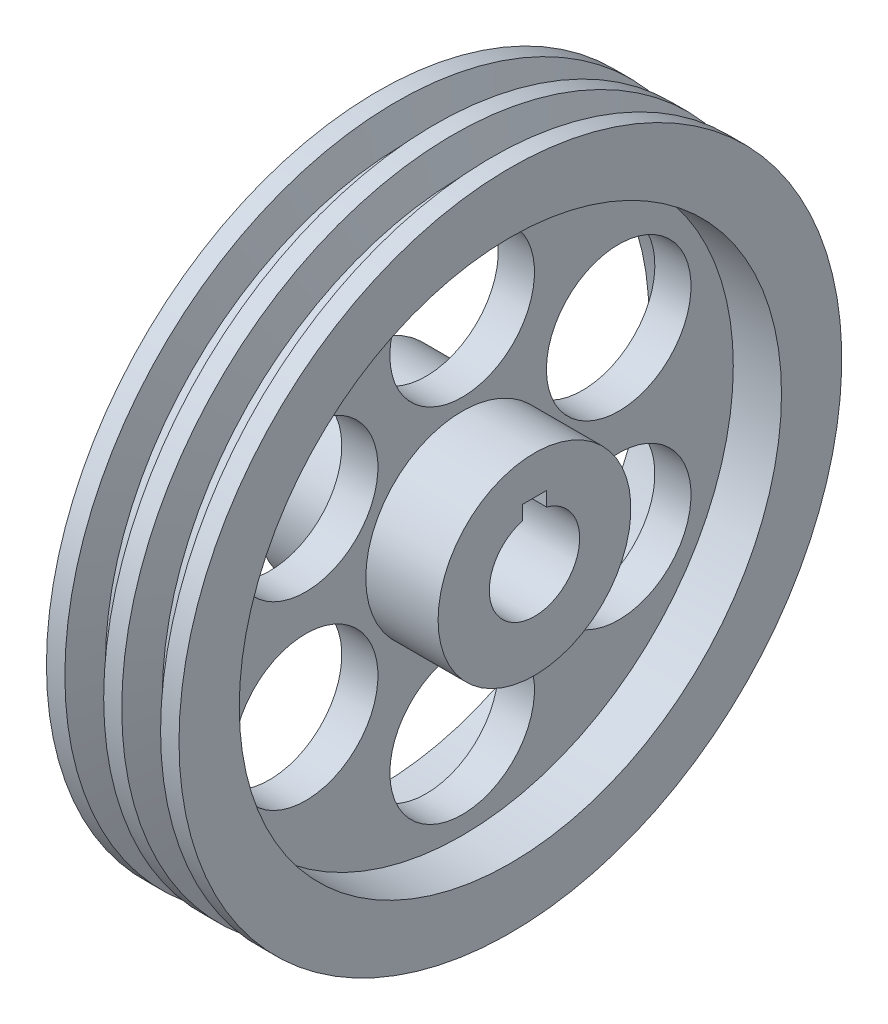
ISO-10303-21;
HEADER;
FILE_DESCRIPTION(('STEP AP214'),'2;1');
FILE_NAME('part.step','',(''),(''),'','','');
FILE_SCHEMA(('AUTOMOTIVE_DESIGN { 1 0 10303 214 1 1 1 1 }'));
ENDSEC;
DATA;
#1=APPLICATION_CONTEXT('core data for automotive mechanical design processes');
#2=APPLICATION_PROTOCOL_DEFINITION('international standard','automotive_design',2000,#1);
#3=PRODUCT_CONTEXT('',#1,'mechanical');
#4=PRODUCT('Part','Part','',(#3));
#5=PRODUCT_RELATED_PRODUCT_CATEGORY('part','',(#4));
#6=PRODUCT_DEFINITION_FORMATION('','',#4);
#7=PRODUCT_DEFINITION_CONTEXT('part definition',#1,'design');
#8=PRODUCT_DEFINITION('design','',#6,#7);
#9=PRODUCT_DEFINITION_SHAPE('','',#8);
#10=(LENGTH_UNIT() NAMED_UNIT(*) SI_UNIT(.MILLI.,.METRE.));
#11=(NAMED_UNIT(*) PLANE_ANGLE_UNIT() SI_UNIT($,.RADIAN.));
#12=(NAMED_UNIT(*) SI_UNIT($,.STERADIAN.) SOLID_ANGLE_UNIT());
#13=UNCERTAINTY_MEASURE_WITH_UNIT(LENGTH_MEASURE(1.E-05),#10,'distance_accuracy_value','');
#14=(GEOMETRIC_REPRESENTATION_CONTEXT(3) GLOBAL_UNCERTAINTY_ASSIGNED_CONTEXT((#13)) GLOBAL_UNIT_ASSIGNED_CONTEXT((#10,
#11,#12)) REPRESENTATION_CONTEXT('',''));
#15=CARTESIAN_POINT('',(0.,0.,0.));
#16=DIRECTION('',(0.,0.,1.));
#17=DIRECTION('',(1.,0.,0.));
#18=AXIS2_PLACEMENT_3D('',#15,#16,#17);
#19=CARTESIAN_POINT('',(14.051864277841,7.5,0.));
#20=DIRECTION('',(-1.,0.,0.));
#21=DIRECTION('',(0.,0.,1.));
#22=AXIS2_PLACEMENT_3D('',#19,#20,#21);
#23=PLANE('',#22);
#24=CARTESIAN_POINT('',(14.051864277841,0.,0.));
#25=DIRECTION('',(-1.,0.,0.));
#26=DIRECTION('',(0.,0.,1.));
#27=AXIS2_PLACEMENT_3D('',#24,#25,#26);
#28=CIRCLE('',#27,16.);
#29=CARTESIAN_POINT('',(14.051864277841,0.,16.));
#30=VERTEX_POINT('',#29);
#31=EDGE_CURVE('E193',#30,#30,#28,.T.);
#32=ORIENTED_EDGE('',*,*,#31,.F.);
#33=EDGE_LOOP('',(#32));
#34=FACE_BOUND('',#33,.T.);
#35=DIRECTION('',(0.,0.,1.));
#36=VECTOR('',#35,1.);
#37=CARTESIAN_POINT('',(14.051864277841,9.6,2.));
#38=LINE('',#37,#36);
#39=CARTESIAN_POINT('',(14.051864277841,9.6,-2.));
#40=VERTEX_POINT('',#39);
#41=CARTESIAN_POINT('',(14.051864277841,9.6,2.));
#42=VERTEX_POINT('',#41);
#43=EDGE_CURVE('E105',#40,#42,#38,.T.);
#44=ORIENTED_EDGE('',*,*,#43,.F.);
#45=DIRECTION('',(0.,1.,0.));
#46=VECTOR('',#45,1.);
#47=CARTESIAN_POINT('',(14.051864277841,9.6,-2.));
#48=LINE('',#47,#46);
#49=CARTESIAN_POINT('',(14.051864277841,7.22841614740048,-2.));
#50=VERTEX_POINT('',#49);
#51=EDGE_CURVE('E83',#50,#40,#48,.T.);
#52=ORIENTED_EDGE('',*,*,#51,.F.);
#53=CARTESIAN_POINT('',(14.051864277841,0.,0.));
#54=DIRECTION('',(-1.,0.,0.));
#55=DIRECTION('',(0.,0.,1.));
#56=AXIS2_PLACEMENT_3D('',#53,#54,#55);
#57=CIRCLE('',#56,7.5);
#58=CARTESIAN_POINT('',(14.051864277841,7.22841614740048,2.));
#59=VERTEX_POINT('',#58);
#60=EDGE_CURVE('E118',#50,#59,#57,.T.);
#61=ORIENTED_EDGE('',*,*,#60,.T.);
#62=DIRECTION('',(0.,-1.,0.));
#63=VECTOR('',#62,1.);
#64=CARTESIAN_POINT('',(14.051864277841,9.6,2.));
#65=LINE('',#64,#63);
#66=EDGE_CURVE('E54',#42,#59,#65,.T.);
#67=ORIENTED_EDGE('',*,*,#66,.F.);
#68=EDGE_LOOP('',(#44,#52,#61,#67));
#69=FACE_BOUND('',#68,.T.);
#70=ADVANCED_FACE('F39',(#34,#69),#23,.F.);
#71=CARTESIAN_POINT('',(-49.9227938913029,0.,0.));
#72=DIRECTION('',(-1.,0.,0.));
#73=DIRECTION('',(0.,0.,1.));
#74=AXIS2_PLACEMENT_3D('',#71,#72,#73);
#75=CYLINDRICAL_SURFACE('',#74,16.);
#76=CARTESIAN_POINT('',(2.05186427784097,0.,0.));
#77=DIRECTION('',(-1.,0.,0.));
#78=DIRECTION('',(0.,0.,1.));
#79=AXIS2_PLACEMENT_3D('',#76,#77,#78);
#80=CIRCLE('',#79,16.);
#81=CARTESIAN_POINT('',(2.05186427784097,0.,16.));
#82=VERTEX_POINT('',#81);
#83=EDGE_CURVE('E189',#82,#82,#80,.T.);
#84=ORIENTED_EDGE('',*,*,#83,.F.);
#85=EDGE_LOOP('',(#84));
#86=FACE_BOUND('',#85,.T.);
#87=ORIENTED_EDGE('',*,*,#31,.T.);
#88=EDGE_LOOP('',(#87));
#89=FACE_BOUND('',#88,.T.);
#90=ADVANCED_FACE('F202',(#86,#89),#75,.T.);
#91=CARTESIAN_POINT('',(2.05186427784096,16.,0.));
#92=DIRECTION('',(-1.,0.,0.));
#93=DIRECTION('',(0.,0.,1.));
#94=AXIS2_PLACEMENT_3D('',#91,#92,#93);
#95=PLANE('',#94);
#96=CARTESIAN_POINT('',(2.05186427784096,15.0000000000003,25.980762113533));
#97=DIRECTION('',(-1.,0.,0.));
#98=DIRECTION('',(0.,0.,1.));
#99=AXIS2_PLACEMENT_3D('',#96,#97,#98);
#100=CIRCLE('',#99,12.);
#101=CARTESIAN_POINT('',(2.05186427784096,15.0000000000003,37.980762113533));
#102=VERTEX_POINT('',#101);
#103=EDGE_CURVE('E339',#102,#102,#100,.T.);
#104=ORIENTED_EDGE('',*,*,#103,.T.);
#105=EDGE_LOOP('',(#104));
#106=FACE_BOUND('',#105,.T.);
#107=CARTESIAN_POINT('',(2.05186427784096,-14.9999999999998,25.9807621135333));
#108=DIRECTION('',(-1.,0.,0.));
#109=DIRECTION('',(0.,0.,1.));
#110=AXIS2_PLACEMENT_3D('',#107,#108,#109);
#111=CIRCLE('',#110,12.);
#112=CARTESIAN_POINT('',(2.05186427784096,-14.9999999999998,37.9807621135333));
#113=VERTEX_POINT('',#112);
#114=EDGE_CURVE('E329',#113,#113,#111,.T.);
#115=ORIENTED_EDGE('',*,*,#114,.T.);
#116=EDGE_LOOP('',(#115));
#117=FACE_BOUND('',#116,.T.);
#118=CARTESIAN_POINT('',(2.05186427784096,-30.,0.));
#119=DIRECTION('',(-1.,0.,0.));
#120=DIRECTION('',(0.,0.,1.));
#121=AXIS2_PLACEMENT_3D('',#118,#119,#120);
#122=CIRCLE('',#121,12.);
#123=CARTESIAN_POINT('',(2.05186427784096,-30.,12.));
#124=VERTEX_POINT('',#123);
#125=EDGE_CURVE('E323',#124,#124,#122,.T.);
#126=ORIENTED_EDGE('',*,*,#125,.T.);
#127=EDGE_LOOP('',(#126));
#128=FACE_BOUND('',#127,.T.);
#129=CARTESIAN_POINT('',(2.05186427784096,-15.0000000000001,-25.9807621135331));
#130=DIRECTION('',(-1.,0.,0.));
#131=DIRECTION('',(0.,0.,1.));
#132=AXIS2_PLACEMENT_3D('',#129,#130,#131);
#133=CIRCLE('',#132,12.);
#134=CARTESIAN_POINT('',(2.05186427784096,-15.0000000000001,-13.9807621135331));
#135=VERTEX_POINT('',#134);
#136=EDGE_CURVE('E320',#135,#135,#133,.T.);
#137=ORIENTED_EDGE('',*,*,#136,.T.);
#138=EDGE_LOOP('',(#137));
#139=FACE_BOUND('',#138,.T.);
#140=CARTESIAN_POINT('',(2.05186427784096,14.9999999999999,-25.9807621135332));
#141=DIRECTION('',(-1.,0.,0.));
#142=DIRECTION('',(0.,0.,1.));
#143=AXIS2_PLACEMENT_3D('',#140,#141,#142);
#144=CIRCLE('',#143,12.);
#145=CARTESIAN_POINT('',(2.05186427784096,14.9999999999999,-13.9807621135332));
#146=VERTEX_POINT('',#145);
#147=EDGE_CURVE('E324',#146,#146,#144,.T.);
#148=ORIENTED_EDGE('',*,*,#147,.T.);
#149=EDGE_LOOP('',(#148));
#150=FACE_BOUND('',#149,.T.);
#151=CARTESIAN_POINT('',(2.05186427784096,30.,0.));
#152=DIRECTION('',(-1.,0.,0.));
#153=DIRECTION('',(0.,0.,1.));
#154=AXIS2_PLACEMENT_3D('',#151,#152,#153);
#155=CIRCLE('',#154,12.);
#156=CARTESIAN_POINT('',(2.05186427784096,30.,12.));
#157=VERTEX_POINT('',#156);
#158=EDGE_CURVE('E108',#157,#157,#155,.T.);
#159=ORIENTED_EDGE('',*,*,#158,.T.);
#160=EDGE_LOOP('',(#159));
#161=FACE_BOUND('',#160,.T.);
#162=CARTESIAN_POINT('',(2.05186427784096,0.,0.));
#163=DIRECTION('',(-1.,0.,0.));
#164=DIRECTION('',(0.,0.,1.));
#165=AXIS2_PLACEMENT_3D('',#162,#163,#164);
#166=CIRCLE('',#165,45.);
#167=CARTESIAN_POINT('',(2.05186427784096,0.,45.));
#168=VERTEX_POINT('',#167);
#169=EDGE_CURVE('E185',#168,#168,#166,.T.);
#170=ORIENTED_EDGE('',*,*,#169,.F.);
#171=EDGE_LOOP('',(#170));
#172=FACE_BOUND('',#171,.T.);
#173=ORIENTED_EDGE('',*,*,#83,.T.);
#174=EDGE_LOOP('',(#173));
#175=FACE_BOUND('',#174,.T.);
#176=ADVANCED_FACE('F207',(#106,#117,#128,#139,#150,#161,#172,#175),#95,.F.);
#177=CARTESIAN_POINT('',(-49.9227938913029,0.,0.));
#178=DIRECTION('',(-1.,0.,0.));
#179=DIRECTION('',(0.,0.,1.));
#180=AXIS2_PLACEMENT_3D('',#177,#178,#179);
#181=CYLINDRICAL_SURFACE('',#180,45.);
#182=CARTESIAN_POINT('',(10.051864277841,0.,0.));
#183=DIRECTION('',(-1.,0.,0.));
#184=DIRECTION('',(0.,0.,1.));
#185=AXIS2_PLACEMENT_3D('',#182,#183,#184);
#186=CIRCLE('',#185,45.);
#187=CARTESIAN_POINT('',(10.051864277841,0.,45.));
#188=VERTEX_POINT('',#187);
#189=EDGE_CURVE('E181',#188,#188,#186,.T.);
#190=ORIENTED_EDGE('',*,*,#189,.F.);
#191=EDGE_LOOP('',(#190));
#192=FACE_BOUND('',#191,.T.);
#193=ORIENTED_EDGE('',*,*,#169,.T.);
#194=EDGE_LOOP('',(#193));
#195=FACE_BOUND('',#194,.T.);
#196=ADVANCED_FACE('F214',(#192,#195),#181,.F.);
#197=CARTESIAN_POINT('',(10.051864277841,45.,0.));
#198=DIRECTION('',(-1.,0.,0.));
#199=DIRECTION('',(0.,0.,1.));
#200=AXIS2_PLACEMENT_3D('',#197,#198,#199);
#201=PLANE('',#200);
#202=CARTESIAN_POINT('',(10.051864277841,0.,0.));
#203=DIRECTION('',(-1.,0.,0.));
#204=DIRECTION('',(0.,0.,1.));
#205=AXIS2_PLACEMENT_3D('',#202,#203,#204);
#206=CIRCLE('',#205,55.);
#207=CARTESIAN_POINT('',(10.051864277841,0.,55.));
#208=VERTEX_POINT('',#207);
#209=EDGE_CURVE('E177',#208,#208,#206,.T.);
#210=ORIENTED_EDGE('',*,*,#209,.F.);
#211=EDGE_LOOP('',(#210));
#212=FACE_BOUND('',#211,.T.);
#213=ORIENTED_EDGE('',*,*,#189,.T.);
#214=EDGE_LOOP('',(#213));
#215=FACE_BOUND('',#214,.T.);
#216=ADVANCED_FACE('F221',(#212,#215),#201,.F.);
#217=CARTESIAN_POINT('',(-49.9227938913029,0.,0.));
#218=DIRECTION('',(-1.,0.,0.));
#219=DIRECTION('',(0.,0.,1.));
#220=AXIS2_PLACEMENT_3D('',#217,#218,#219);
#221=CYLINDRICAL_SURFACE('',#220,55.);
#222=CARTESIAN_POINT('',(6.99514041073759,0.,0.));
#223=DIRECTION('',(-1.,0.,0.));
#224=DIRECTION('',(0.,0.,1.));
#225=AXIS2_PLACEMENT_3D('',#222,#223,#224);
#226=CIRCLE('',#225,55.);
#227=CARTESIAN_POINT('',(6.99514041073759,0.,55.));
#228=VERTEX_POINT('',#227);
#229=EDGE_CURVE('E173',#228,#228,#226,.T.);
#230=ORIENTED_EDGE('',*,*,#229,.F.);
#231=EDGE_LOOP('',(#230));
#232=FACE_BOUND('',#231,.T.);
#233=ORIENTED_EDGE('',*,*,#209,.T.);
#234=EDGE_LOOP('',(#233));
#235=FACE_BOUND('',#234,.T.);
#236=ADVANCED_FACE('F225',(#232,#235),#221,.T.);
#237=CARTESIAN_POINT('',(6.99514041073759,0.,0.));
#238=DIRECTION('',(1.,0.,0.));
#239=DIRECTION('',(0.,0.,-1.));
#240=AXIS2_PLACEMENT_3D('',#237,#238,#239);
#241=CONICAL_SURFACE('',#240,55.,1.23918376891598);
#242=CARTESIAN_POINT('',(5.27350234428928,0.,0.));
#243=DIRECTION('',(-1.,0.,0.));
#244=DIRECTION('',(0.,0.,1.));
#245=AXIS2_PLACEMENT_3D('',#242,#243,#244);
#246=CIRCLE('',#245,50.);
#247=CARTESIAN_POINT('',(5.27350234428928,0.,50.));
#248=VERTEX_POINT('',#247);
#249=EDGE_CURVE('E169',#248,#248,#246,.T.);
#250=ORIENTED_EDGE('',*,*,#249,.F.);
#251=EDGE_LOOP('',(#250));
#252=FACE_BOUND('',#251,.T.);
#253=ORIENTED_EDGE('',*,*,#229,.T.);
#254=EDGE_LOOP('',(#253));
#255=FACE_BOUND('',#254,.T.);
#256=ADVANCED_FACE('F229',(#252,#255),#241,.T.);
#257=CARTESIAN_POINT('',(-49.9227938913029,0.,0.));
#258=DIRECTION('',(-1.,0.,0.));
#259=DIRECTION('',(0.,0.,1.));
#260=AXIS2_PLACEMENT_3D('',#257,#258,#259);
#261=CYLINDRICAL_SURFACE('',#260,50.);
#262=CARTESIAN_POINT('',(2.27350234428927,0.,0.));
#263=DIRECTION('',(-1.,0.,0.));
#264=DIRECTION('',(0.,0.,1.));
#265=AXIS2_PLACEMENT_3D('',#262,#263,#264);
#266=CIRCLE('',#265,50.);
#267=CARTESIAN_POINT('',(2.27350234428927,0.,50.));
#268=VERTEX_POINT('',#267);
#269=EDGE_CURVE('E165',#268,#268,#266,.T.);
#270=ORIENTED_EDGE('',*,*,#269,.F.);
#271=EDGE_LOOP('',(#270));
#272=FACE_BOUND('',#271,.T.);
#273=ORIENTED_EDGE('',*,*,#249,.T.);
#274=EDGE_LOOP('',(#273));
#275=FACE_BOUND('',#274,.T.);
#276=ADVANCED_FACE('F233',(#272,#275),#261,.T.);
#277=CARTESIAN_POINT('',(2.27350234428927,0.,0.));
#278=DIRECTION('',(-1.,0.,0.));
#279=DIRECTION('',(0.,0.,1.));
#280=AXIS2_PLACEMENT_3D('',#277,#278,#279);
#281=CONICAL_SURFACE('',#280,50.,1.23918376891598);
#282=CARTESIAN_POINT('',(0.551864277840965,0.,0.));
#283=DIRECTION('',(-1.,0.,0.));
#284=DIRECTION('',(0.,0.,1.));
#285=AXIS2_PLACEMENT_3D('',#282,#283,#284);
#286=CIRCLE('',#285,55.);
#287=CARTESIAN_POINT('',(0.551864277840965,0.,55.));
#288=VERTEX_POINT('',#287);
#289=EDGE_CURVE('E161',#288,#288,#286,.T.);
#290=ORIENTED_EDGE('',*,*,#289,.F.);
#291=EDGE_LOOP('',(#290));
#292=FACE_BOUND('',#291,.T.);
#293=ORIENTED_EDGE('',*,*,#269,.T.);
#294=EDGE_LOOP('',(#293));
#295=FACE_BOUND('',#294,.T.);
#296=ADVANCED_FACE('F237',(#292,#295),#281,.T.);
#297=CARTESIAN_POINT('',(-49.9227938913029,0.,0.));
#298=DIRECTION('',(-1.,0.,0.));
#299=DIRECTION('',(0.,0.,1.));
#300=AXIS2_PLACEMENT_3D('',#297,#298,#299);
#301=CYLINDRICAL_SURFACE('',#300,55.);
#302=CARTESIAN_POINT('',(-2.44813572215903,0.,0.));
#303=DIRECTION('',(-1.,0.,0.));
#304=DIRECTION('',(0.,0.,1.));
#305=AXIS2_PLACEMENT_3D('',#302,#303,#304);
#306=CIRCLE('',#305,55.);
#307=CARTESIAN_POINT('',(-2.44813572215903,0.,55.));
#308=VERTEX_POINT('',#307);
#309=EDGE_CURVE('E157',#308,#308,#306,.T.);
#310=ORIENTED_EDGE('',*,*,#309,.F.);
#311=EDGE_LOOP('',(#310));
#312=FACE_BOUND('',#311,.T.);
#313=ORIENTED_EDGE('',*,*,#289,.T.);
#314=EDGE_LOOP('',(#313));
#315=FACE_BOUND('',#314,.T.);
#316=ADVANCED_FACE('F241',(#312,#315),#301,.T.);
#317=CARTESIAN_POINT('',(-2.44813572215903,0.,0.));
#318=DIRECTION('',(1.,0.,0.));
#319=DIRECTION('',(0.,0.,-1.));
#320=AXIS2_PLACEMENT_3D('',#317,#318,#319);
#321=CONICAL_SURFACE('',#320,55.,1.23918376891598);
#322=CARTESIAN_POINT('',(-4.16977378860734,0.,0.));
#323=DIRECTION('',(-1.,0.,0.));
#324=DIRECTION('',(0.,0.,1.));
#325=AXIS2_PLACEMENT_3D('',#322,#323,#324);
#326=CIRCLE('',#325,50.);
#327=CARTESIAN_POINT('',(-4.16977378860734,0.,50.));
#328=VERTEX_POINT('',#327);
#329=EDGE_CURVE('E153',#328,#328,#326,.T.);
#330=ORIENTED_EDGE('',*,*,#329,.F.);
#331=EDGE_LOOP('',(#330));
#332=FACE_BOUND('',#331,.T.);
#333=ORIENTED_EDGE('',*,*,#309,.T.);
#334=EDGE_LOOP('',(#333));
#335=FACE_BOUND('',#334,.T.);
#336=ADVANCED_FACE('F245',(#332,#335),#321,.T.);
#337=CARTESIAN_POINT('',(-49.9227938913029,0.,0.));
#338=DIRECTION('',(-1.,0.,0.));
#339=DIRECTION('',(0.,0.,1.));
#340=AXIS2_PLACEMENT_3D('',#337,#338,#339);
#341=CYLINDRICAL_SURFACE('',#340,50.);
#342=CARTESIAN_POINT('',(-7.16977378860734,0.,0.));
#343=DIRECTION('',(-1.,0.,0.));
#344=DIRECTION('',(0.,0.,1.));
#345=AXIS2_PLACEMENT_3D('',#342,#343,#344);
#346=CIRCLE('',#345,50.);
#347=CARTESIAN_POINT('',(-7.16977378860734,0.,50.));
#348=VERTEX_POINT('',#347);
#349=EDGE_CURVE('E149',#348,#348,#346,.T.);
#350=ORIENTED_EDGE('',*,*,#349,.F.);
#351=EDGE_LOOP('',(#350));
#352=FACE_BOUND('',#351,.T.);
#353=ORIENTED_EDGE('',*,*,#329,.T.);
#354=EDGE_LOOP('',(#353));
#355=FACE_BOUND('',#354,.T.);
#356=ADVANCED_FACE('F249',(#352,#355),#341,.T.);
#357=CARTESIAN_POINT('',(-7.16977378860734,0.,0.));
#358=DIRECTION('',(-1.,0.,0.));
#359=DIRECTION('',(0.,0.,1.));
#360=AXIS2_PLACEMENT_3D('',#357,#358,#359);
#361=CONICAL_SURFACE('',#360,50.,1.23918376891598);
#362=CARTESIAN_POINT('',(-8.89141185505565,0.,0.));
#363=DIRECTION('',(-1.,0.,0.));
#364=DIRECTION('',(0.,0.,1.));
#365=AXIS2_PLACEMENT_3D('',#362,#363,#364);
#366=CIRCLE('',#365,55.);
#367=CARTESIAN_POINT('',(-8.89141185505565,0.,55.));
#368=VERTEX_POINT('',#367);
#369=EDGE_CURVE('E145',#368,#368,#366,.T.);
#370=ORIENTED_EDGE('',*,*,#369,.F.);
#371=EDGE_LOOP('',(#370));
#372=FACE_BOUND('',#371,.T.);
#373=ORIENTED_EDGE('',*,*,#349,.T.);
#374=EDGE_LOOP('',(#373));
#375=FACE_BOUND('',#374,.T.);
#376=ADVANCED_FACE('F253',(#372,#375),#361,.T.);
#377=CARTESIAN_POINT('',(-49.9227938913029,0.,0.));
#378=DIRECTION('',(-1.,0.,0.));
#379=DIRECTION('',(0.,0.,1.));
#380=AXIS2_PLACEMENT_3D('',#377,#378,#379);
#381=CYLINDRICAL_SURFACE('',#380,55.);
#382=CARTESIAN_POINT('',(-11.948135722159,0.,0.));
#383=DIRECTION('',(-1.,0.,0.));
#384=DIRECTION('',(0.,0.,1.));
#385=AXIS2_PLACEMENT_3D('',#382,#383,#384);
#386=CIRCLE('',#385,55.);
#387=CARTESIAN_POINT('',(-11.948135722159,0.,55.));
#388=VERTEX_POINT('',#387);
#389=EDGE_CURVE('E141',#388,#388,#386,.T.);
#390=ORIENTED_EDGE('',*,*,#389,.F.);
#391=EDGE_LOOP('',(#390));
#392=FACE_BOUND('',#391,.T.);
#393=ORIENTED_EDGE('',*,*,#369,.T.);
#394=EDGE_LOOP('',(#393));
#395=FACE_BOUND('',#394,.T.);
#396=ADVANCED_FACE('F257',(#392,#395),#381,.T.);
#397=CARTESIAN_POINT('',(-11.948135722159,45.,0.));
#398=DIRECTION('',(1.,0.,0.));
#399=DIRECTION('',(0.,0.,-1.));
#400=AXIS2_PLACEMENT_3D('',#397,#398,#399);
#401=PLANE('',#400);
#402=CARTESIAN_POINT('',(-11.948135722159,0.,0.));
#403=DIRECTION('',(-1.,0.,0.));
#404=DIRECTION('',(0.,0.,1.));
#405=AXIS2_PLACEMENT_3D('',#402,#403,#404);
#406=CIRCLE('',#405,45.);
#407=CARTESIAN_POINT('',(-11.948135722159,0.,45.));
#408=VERTEX_POINT('',#407);
#409=EDGE_CURVE('E137',#408,#408,#406,.T.);
#410=ORIENTED_EDGE('',*,*,#409,.F.);
#411=EDGE_LOOP('',(#410));
#412=FACE_BOUND('',#411,.T.);
#413=ORIENTED_EDGE('',*,*,#389,.T.);
#414=EDGE_LOOP('',(#413));
#415=FACE_BOUND('',#414,.T.);
#416=ADVANCED_FACE('F261',(#412,#415),#401,.F.);
#417=CARTESIAN_POINT('',(-49.9227938913029,0.,0.));
#418=DIRECTION('',(-1.,0.,0.));
#419=DIRECTION('',(0.,0.,1.));
#420=AXIS2_PLACEMENT_3D('',#417,#418,#419);
#421=CYLINDRICAL_SURFACE('',#420,45.);
#422=CARTESIAN_POINT('',(-3.94813572215903,0.,0.));
#423=DIRECTION('',(-1.,0.,0.));
#424=DIRECTION('',(0.,0.,1.));
#425=AXIS2_PLACEMENT_3D('',#422,#423,#424);
#426=CIRCLE('',#425,45.);
#427=CARTESIAN_POINT('',(-3.94813572215903,0.,45.));
#428=VERTEX_POINT('',#427);
#429=EDGE_CURVE('E133',#428,#428,#426,.T.);
#430=ORIENTED_EDGE('',*,*,#429,.F.);
#431=EDGE_LOOP('',(#430));
#432=FACE_BOUND('',#431,.T.);
#433=ORIENTED_EDGE('',*,*,#409,.T.);
#434=EDGE_LOOP('',(#433));
#435=FACE_BOUND('',#434,.T.);
#436=ADVANCED_FACE('F265',(#432,#435),#421,.F.);
#437=CARTESIAN_POINT('',(-3.94813572215903,16.,0.));
#438=DIRECTION('',(1.,0.,0.));
#439=DIRECTION('',(0.,0.,-1.));
#440=AXIS2_PLACEMENT_3D('',#437,#438,#439);
#441=PLANE('',#440);
#442=CARTESIAN_POINT('',(-3.94813572215903,15.0000000000003,25.980762113533));
#443=DIRECTION('',(-1.,0.,0.));
#444=DIRECTION('',(0.,-0.866025403784433,0.50000000000001));
#445=AXIS2_PLACEMENT_3D('',#442,#443,#444);
#446=CIRCLE('',#445,12.);
#447=CARTESIAN_POINT('',(-3.94813572215903,4.60769515458711,31.9807621135331));
#448=VERTEX_POINT('',#447);
#449=EDGE_CURVE('E399',#448,#448,#446,.T.);
#450=ORIENTED_EDGE('',*,*,#449,.F.);
#451=EDGE_LOOP('',(#450));
#452=FACE_BOUND('',#451,.T.);
#453=CARTESIAN_POINT('',(-3.94813572215903,-14.9999999999998,25.9807621135333));
#454=DIRECTION('',(-1.,0.,0.));
#455=DIRECTION('',(0.,-0.866025403784443,-0.499999999999992));
#456=AXIS2_PLACEMENT_3D('',#453,#454,#455);
#457=CIRCLE('',#456,12.);
#458=CARTESIAN_POINT('',(-3.94813572215903,-25.3923048454131,19.9807621135334));
#459=VERTEX_POINT('',#458);
#460=EDGE_CURVE('E403',#459,#459,#457,.T.);
#461=ORIENTED_EDGE('',*,*,#460,.F.);
#462=EDGE_LOOP('',(#461));
#463=FACE_BOUND('',#462,.T.);
#464=CARTESIAN_POINT('',(-3.94813572215903,-30.,0.));
#465=DIRECTION('',(-1.,0.,0.));
#466=DIRECTION('',(0.,0.,-1.));
#467=AXIS2_PLACEMENT_3D('',#464,#465,#466);
#468=CIRCLE('',#467,12.);
#469=CARTESIAN_POINT('',(-3.94813572215903,-30.,-12.));
#470=VERTEX_POINT('',#469);
#471=EDGE_CURVE('E407',#470,#470,#468,.T.);
#472=ORIENTED_EDGE('',*,*,#471,.F.);
#473=EDGE_LOOP('',(#472));
#474=FACE_BOUND('',#473,.T.);
#475=CARTESIAN_POINT('',(-3.94813572215903,-15.0000000000001,-25.9807621135331));
#476=DIRECTION('',(-1.,0.,0.));
#477=DIRECTION('',(0.,0.866025403784436,-0.500000000000004));
#478=AXIS2_PLACEMENT_3D('',#475,#476,#477);
#479=CIRCLE('',#478,12.);
#480=CARTESIAN_POINT('',(-3.94813572215903,-4.60769515458688,-31.9807621135331));
#481=VERTEX_POINT('',#480);
#482=EDGE_CURVE('E317',#481,#481,#479,.T.);
#483=ORIENTED_EDGE('',*,*,#482,.F.);
#484=EDGE_LOOP('',(#483));
#485=FACE_BOUND('',#484,.T.);
#486=CARTESIAN_POINT('',(-3.94813572215903,14.9999999999999,-25.9807621135332));
#487=DIRECTION('',(-1.,0.,0.));
#488=DIRECTION('',(0.,0.86602540378444,0.499999999999998));
#489=AXIS2_PLACEMENT_3D('',#486,#487,#488);
#490=CIRCLE('',#489,12.);
#491=CARTESIAN_POINT('',(-3.94813572215903,25.3923048454132,-19.9807621135332));
#492=VERTEX_POINT('',#491);
#493=EDGE_CURVE('E332',#492,#492,#490,.T.);
#494=ORIENTED_EDGE('',*,*,#493,.F.);
#495=EDGE_LOOP('',(#494));
#496=FACE_BOUND('',#495,.T.);
#497=CARTESIAN_POINT('',(-3.94813572215903,30.,0.));
#498=DIRECTION('',(-1.,0.,0.));
#499=DIRECTION('',(0.,0.,1.));
#500=AXIS2_PLACEMENT_3D('',#497,#498,#499);
#501=CIRCLE('',#500,12.);
#502=CARTESIAN_POINT('',(-3.94813572215903,30.,12.));
#503=VERTEX_POINT('',#502);
#504=EDGE_CURVE('E342',#503,#503,#501,.T.);
#505=ORIENTED_EDGE('',*,*,#504,.F.);
#506=EDGE_LOOP('',(#505));
#507=FACE_BOUND('',#506,.T.);
#508=CARTESIAN_POINT('',(-3.94813572215903,0.,0.));
#509=DIRECTION('',(-1.,0.,0.));
#510=DIRECTION('',(0.,0.,1.));
#511=AXIS2_PLACEMENT_3D('',#508,#509,#510);
#512=CIRCLE('',#511,16.);
#513=CARTESIAN_POINT('',(-3.94813572215903,0.,16.));
#514=VERTEX_POINT('',#513);
#515=EDGE_CURVE('E129',#514,#514,#512,.T.);
#516=ORIENTED_EDGE('',*,*,#515,.F.);
#517=EDGE_LOOP('',(#516));
#518=FACE_BOUND('',#517,.T.);
#519=ORIENTED_EDGE('',*,*,#429,.T.);
#520=EDGE_LOOP('',(#519));
#521=FACE_BOUND('',#520,.T.);
#522=ADVANCED_FACE('F269',(#452,#463,#474,#485,#496,#507,#518,#521),#441,.F.);
#523=CARTESIAN_POINT('',(-49.9227938913029,0.,0.));
#524=DIRECTION('',(-1.,0.,0.));
#525=DIRECTION('',(0.,0.,1.));
#526=AXIS2_PLACEMENT_3D('',#523,#524,#525);
#527=CYLINDRICAL_SURFACE('',#526,16.);
#528=CARTESIAN_POINT('',(-15.948135722159,0.,0.));
#529=DIRECTION('',(-1.,0.,0.));
#530=DIRECTION('',(0.,0.,1.));
#531=AXIS2_PLACEMENT_3D('',#528,#529,#530);
#532=CIRCLE('',#531,16.);
#533=CARTESIAN_POINT('',(-15.948135722159,0.,16.));
#534=VERTEX_POINT('',#533);
#535=EDGE_CURVE('E125',#534,#534,#532,.T.);
#536=ORIENTED_EDGE('',*,*,#535,.F.);
#537=EDGE_LOOP('',(#536));
#538=FACE_BOUND('',#537,.T.);
#539=ORIENTED_EDGE('',*,*,#515,.T.);
#540=EDGE_LOOP('',(#539));
#541=FACE_BOUND('',#540,.T.);
#542=ADVANCED_FACE('F273',(#538,#541),#527,.T.);
#543=CARTESIAN_POINT('',(-15.948135722159,7.5,0.));
#544=DIRECTION('',(1.,0.,0.));
#545=DIRECTION('',(0.,0.,-1.));
#546=AXIS2_PLACEMENT_3D('',#543,#544,#545);
#547=PLANE('',#546);
#548=CARTESIAN_POINT('',(-15.948135722159,0.,0.));
#549=DIRECTION('',(-1.,0.,0.));
#550=DIRECTION('',(0.,0.,1.));
#551=AXIS2_PLACEMENT_3D('',#548,#549,#550);
#552=CIRCLE('',#551,7.5);
#553=CARTESIAN_POINT('',(-15.948135722159,7.22841614740048,-2.));
#554=VERTEX_POINT('',#553);
#555=CARTESIAN_POINT('',(-15.948135722159,7.22841614740048,2.));
#556=VERTEX_POINT('',#555);
#557=EDGE_CURVE('E101',#554,#556,#552,.T.);
#558=ORIENTED_EDGE('',*,*,#557,.F.);
#559=DIRECTION('',(0.,1.,0.));
#560=VECTOR('',#559,1.);
#561=CARTESIAN_POINT('',(-15.948135722159,9.6,-2.));
#562=LINE('',#561,#560);
#563=CARTESIAN_POINT('',(-15.948135722159,9.6,-2.));
#564=VERTEX_POINT('',#563);
#565=EDGE_CURVE('E81',#554,#564,#562,.T.);
#566=ORIENTED_EDGE('',*,*,#565,.T.);
#567=DIRECTION('',(0.,0.,1.));
#568=VECTOR('',#567,1.);
#569=CARTESIAN_POINT('',(-15.948135722159,9.6,2.));
#570=LINE('',#569,#568);
#571=CARTESIAN_POINT('',(-15.948135722159,9.6,2.));
#572=VERTEX_POINT('',#571);
#573=EDGE_CURVE('E92',#564,#572,#570,.T.);
#574=ORIENTED_EDGE('',*,*,#573,.T.);
#575=DIRECTION('',(0.,-1.,0.));
#576=VECTOR('',#575,1.);
#577=CARTESIAN_POINT('',(-15.948135722159,9.6,2.));
#578=LINE('',#577,#576);
#579=EDGE_CURVE('E89',#572,#556,#578,.T.);
#580=ORIENTED_EDGE('',*,*,#579,.T.);
#581=EDGE_LOOP('',(#558,#566,#574,#580));
#582=FACE_BOUND('',#581,.T.);
#583=ORIENTED_EDGE('',*,*,#535,.T.);
#584=EDGE_LOOP('',(#583));
#585=FACE_BOUND('',#584,.T.);
#586=ADVANCED_FACE('F98',(#582,#585),#547,.F.);
#587=CARTESIAN_POINT('',(-49.9227938913029,0.,0.));
#588=DIRECTION('',(-1.,0.,0.));
#589=DIRECTION('',(0.,0.,1.));
#590=AXIS2_PLACEMENT_3D('',#587,#588,#589);
#591=CYLINDRICAL_SURFACE('',#590,7.5);
#592=ORIENTED_EDGE('',*,*,#60,.F.);
#593=DIRECTION('',(-1.,0.,0.));
#594=VECTOR('',#593,1.);
#595=CARTESIAN_POINT('',(-49.9227938913029,7.22841614740048,-2.));
#596=LINE('',#595,#594);
#597=EDGE_CURVE('E11',#50,#554,#596,.T.);
#598=ORIENTED_EDGE('',*,*,#597,.T.);
#599=ORIENTED_EDGE('',*,*,#557,.T.);
#600=DIRECTION('',(-1.,0.,0.));
#601=VECTOR('',#600,1.);
#602=CARTESIAN_POINT('',(-49.9227938913029,7.22841614740048,2.));
#603=LINE('',#602,#601);
#604=EDGE_CURVE('E47',#556,#59,#603,.F.);
#605=ORIENTED_EDGE('',*,*,#604,.T.);
#606=EDGE_LOOP('',(#592,#598,#599,#605));
#607=FACE_BOUND('',#606,.T.);
#608=ADVANCED_FACE('F199',(#607),#591,.F.);
#609=CARTESIAN_POINT('',(-15.948135722159,9.6,-2.));
#610=DIRECTION('',(0.,0.,-1.));
#611=DIRECTION('',(0.,1.,0.));
#612=AXIS2_PLACEMENT_3D('',#609,#610,#611);
#613=PLANE('',#612);
#614=ORIENTED_EDGE('',*,*,#51,.T.);
#615=DIRECTION('',(1.,0.,0.));
#616=VECTOR('',#615,1.);
#617=CARTESIAN_POINT('',(-15.948135722159,9.6,-2.));
#618=LINE('',#617,#616);
#619=EDGE_CURVE('E77',#564,#40,#618,.T.);
#620=ORIENTED_EDGE('',*,*,#619,.F.);
#621=ORIENTED_EDGE('',*,*,#565,.F.);
#622=ORIENTED_EDGE('',*,*,#597,.F.);
#623=EDGE_LOOP('',(#614,#620,#621,#622));
#624=FACE_BOUND('',#623,.T.);
#625=ADVANCED_FACE('F79',(#624),#613,.F.);
#626=CARTESIAN_POINT('',(-15.948135722159,9.6,2.));
#627=DIRECTION('',(0.,0.,1.));
#628=DIRECTION('',(0.,-1.,0.));
#629=AXIS2_PLACEMENT_3D('',#626,#627,#628);
#630=PLANE('',#629);
#631=ORIENTED_EDGE('',*,*,#579,.F.);
#632=DIRECTION('',(1.,0.,0.));
#633=VECTOR('',#632,1.);
#634=CARTESIAN_POINT('',(-15.948135722159,9.6,2.));
#635=LINE('',#634,#633);
#636=EDGE_CURVE('E88',#572,#42,#635,.T.);
#637=ORIENTED_EDGE('',*,*,#636,.T.);
#638=ORIENTED_EDGE('',*,*,#66,.T.);
#639=ORIENTED_EDGE('',*,*,#604,.F.);
#640=EDGE_LOOP('',(#631,#637,#638,#639));
#641=FACE_BOUND('',#640,.T.);
#642=ADVANCED_FACE('F284',(#641),#630,.F.);
#643=CARTESIAN_POINT('',(-15.948135722159,9.6,2.));
#644=DIRECTION('',(0.,1.,0.));
#645=DIRECTION('',(0.,0.,1.));
#646=AXIS2_PLACEMENT_3D('',#643,#644,#645);
#647=PLANE('',#646);
#648=ORIENTED_EDGE('',*,*,#43,.T.);
#649=ORIENTED_EDGE('',*,*,#636,.F.);
#650=ORIENTED_EDGE('',*,*,#573,.F.);
#651=ORIENTED_EDGE('',*,*,#619,.T.);
#652=EDGE_LOOP('',(#648,#649,#650,#651));
#653=FACE_BOUND('',#652,.T.);
#654=ADVANCED_FACE('F93',(#653),#647,.F.);
#655=CARTESIAN_POINT('',(14.051864277841,30.,0.));
#656=DIRECTION('',(-1.,0.,0.));
#657=DIRECTION('',(0.,0.,1.));
#658=AXIS2_PLACEMENT_3D('',#655,#656,#657);
#659=CYLINDRICAL_SURFACE('',#658,12.);
#660=ORIENTED_EDGE('',*,*,#504,.T.);
#661=EDGE_LOOP('',(#660));
#662=FACE_BOUND('',#661,.T.);
#663=ORIENTED_EDGE('',*,*,#158,.F.);
#664=EDGE_LOOP('',(#663));
#665=FACE_BOUND('',#664,.T.);
#666=ADVANCED_FACE('F287',(#662,#665),#659,.F.);
#667=CARTESIAN_POINT('',(14.051864277841,14.9999999999999,-25.9807621135332));
#668=DIRECTION('',(-1.,0.,0.));
#669=DIRECTION('',(0.,0.,1.));
#670=AXIS2_PLACEMENT_3D('',#667,#668,#669);
#671=CYLINDRICAL_SURFACE('',#670,12.);
#672=ORIENTED_EDGE('',*,*,#493,.T.);
#673=EDGE_LOOP('',(#672));
#674=FACE_BOUND('',#673,.T.);
#675=ORIENTED_EDGE('',*,*,#147,.F.);
#676=EDGE_LOOP('',(#675));
#677=FACE_BOUND('',#676,.T.);
#678=ADVANCED_FACE('F292',(#674,#677),#671,.F.);
#679=CARTESIAN_POINT('',(14.051864277841,-15.0000000000001,-25.9807621135331));
#680=DIRECTION('',(-1.,0.,0.));
#681=DIRECTION('',(0.,0.,1.));
#682=AXIS2_PLACEMENT_3D('',#679,#680,#681);
#683=CYLINDRICAL_SURFACE('',#682,12.);
#684=ORIENTED_EDGE('',*,*,#482,.T.);
#685=EDGE_LOOP('',(#684));
#686=FACE_BOUND('',#685,.T.);
#687=ORIENTED_EDGE('',*,*,#136,.F.);
#688=EDGE_LOOP('',(#687));
#689=FACE_BOUND('',#688,.T.);
#690=ADVANCED_FACE('F296',(#686,#689),#683,.F.);
#691=CARTESIAN_POINT('',(14.051864277841,-30.,0.));
#692=DIRECTION('',(-1.,0.,0.));
#693=DIRECTION('',(0.,0.,1.));
#694=AXIS2_PLACEMENT_3D('',#691,#692,#693);
#695=CYLINDRICAL_SURFACE('',#694,12.);
#696=ORIENTED_EDGE('',*,*,#471,.T.);
#697=EDGE_LOOP('',(#696));
#698=FACE_BOUND('',#697,.T.);
#699=ORIENTED_EDGE('',*,*,#125,.F.);
#700=EDGE_LOOP('',(#699));
#701=FACE_BOUND('',#700,.T.);
#702=ADVANCED_FACE('F305',(#698,#701),#695,.F.);
#703=CARTESIAN_POINT('',(14.051864277841,-14.9999999999998,25.9807621135333));
#704=DIRECTION('',(-1.,0.,0.));
#705=DIRECTION('',(0.,0.,1.));
#706=AXIS2_PLACEMENT_3D('',#703,#704,#705);
#707=CYLINDRICAL_SURFACE('',#706,12.);
#708=ORIENTED_EDGE('',*,*,#460,.T.);
#709=EDGE_LOOP('',(#708));
#710=FACE_BOUND('',#709,.T.);
#711=ORIENTED_EDGE('',*,*,#114,.F.);
#712=EDGE_LOOP('',(#711));
#713=FACE_BOUND('',#712,.T.);
#714=ADVANCED_FACE('F301',(#710,#713),#707,.F.);
#715=CARTESIAN_POINT('',(14.051864277841,15.0000000000003,25.980762113533));
#716=DIRECTION('',(-1.,0.,0.));
#717=DIRECTION('',(0.,0.,1.));
#718=AXIS2_PLACEMENT_3D('',#715,#716,#717);
#719=CYLINDRICAL_SURFACE('',#718,12.);
#720=ORIENTED_EDGE('',*,*,#449,.T.);
#721=EDGE_LOOP('',(#720));
#722=FACE_BOUND('',#721,.T.);
#723=ORIENTED_EDGE('',*,*,#103,.F.);
#724=EDGE_LOOP('',(#723));
#725=FACE_BOUND('',#724,.T.);
#726=ADVANCED_FACE('F298',(#722,#725),#719,.F.);
#727=CLOSED_SHELL('',(#70,#90,#176,#196,#216,#236,#256,#276,#296,#316,#336,#356,#376,#396,#416,
#436,#522,#542,#586,#608,#625,#642,#654,#666,#678,#690,#702,#714,#726));
#728=MANIFOLD_SOLID_BREP('B2',#727);
#729=ADVANCED_BREP_SHAPE_REPRESENTATION('',(#18,#728),#14);
#730=SHAPE_DEFINITION_REPRESENTATION(#9,#729);
ENDSEC;
END-ISO-10303-21;
